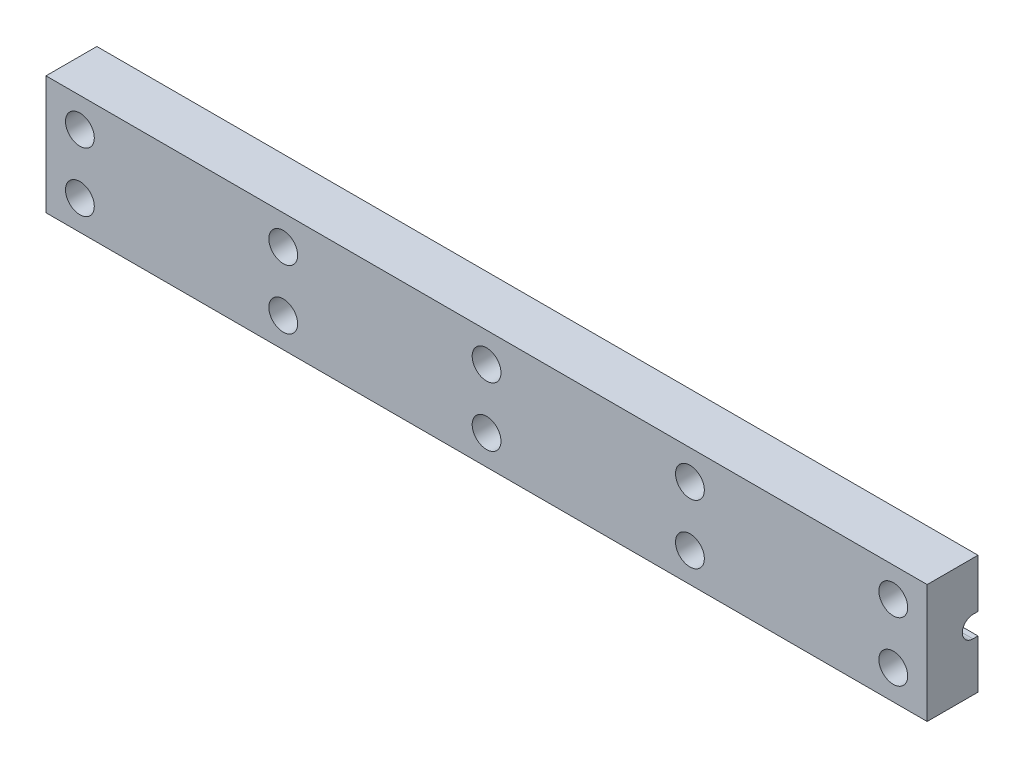
ISO-10303-21;
HEADER;
FILE_DESCRIPTION(('STEP AP214'),'2;1');
FILE_NAME('part.step','',(''),(''),'','','');
FILE_SCHEMA(('AUTOMOTIVE_DESIGN { 1 0 10303 214 1 1 1 1 }'));
ENDSEC;
DATA;
#1=APPLICATION_CONTEXT('core data for automotive mechanical design processes');
#2=APPLICATION_PROTOCOL_DEFINITION('international standard','automotive_design',2000,#1);
#3=PRODUCT_CONTEXT('',#1,'mechanical');
#4=PRODUCT('Part','Part','',(#3));
#5=PRODUCT_RELATED_PRODUCT_CATEGORY('part','',(#4));
#6=PRODUCT_DEFINITION_FORMATION('','',#4);
#7=PRODUCT_DEFINITION_CONTEXT('part definition',#1,'design');
#8=PRODUCT_DEFINITION('design','',#6,#7);
#9=PRODUCT_DEFINITION_SHAPE('','',#8);
#10=(LENGTH_UNIT() NAMED_UNIT(*) SI_UNIT(.MILLI.,.METRE.));
#11=(NAMED_UNIT(*) PLANE_ANGLE_UNIT() SI_UNIT($,.RADIAN.));
#12=(NAMED_UNIT(*) SI_UNIT($,.STERADIAN.) SOLID_ANGLE_UNIT());
#13=UNCERTAINTY_MEASURE_WITH_UNIT(LENGTH_MEASURE(1.E-05),#10,'distance_accuracy_value','');
#14=(GEOMETRIC_REPRESENTATION_CONTEXT(3) GLOBAL_UNCERTAINTY_ASSIGNED_CONTEXT((#13)) GLOBAL_UNIT_ASSIGNED_CONTEXT((#10,
#11,#12)) REPRESENTATION_CONTEXT('',''));
#15=CARTESIAN_POINT('',(0.,0.,0.));
#16=DIRECTION('',(0.,0.,1.));
#17=DIRECTION('',(1.,0.,0.));
#18=AXIS2_PLACEMENT_3D('',#15,#16,#17);
#19=CARTESIAN_POINT('',(170.645147999783,197.163538158501,246.970904960978));
#20=DIRECTION('',(0.,0.,1.));
#21=DIRECTION('',(1.,0.,0.));
#22=AXIS2_PLACEMENT_3D('',#19,#20,#21);
#23=PLANE('',#22);
#24=CARTESIAN_POINT('',(150.645147999783,197.6635381585,246.970904960979));
#25=DIRECTION('',(0.,0.,1.));
#26=DIRECTION('',(1.,0.,0.));
#27=AXIS2_PLACEMENT_3D('',#24,#25,#26);
#28=CIRCLE('',#27,1.70000000000001);
#29=CARTESIAN_POINT('',(152.345147999783,197.6635381585,246.970904960979));
#30=VERTEX_POINT('',#29);
#31=EDGE_CURVE('E223',#30,#30,#28,.T.);
#32=ORIENTED_EDGE('',*,*,#31,.F.);
#33=EDGE_LOOP('',(#32));
#34=FACE_BOUND('',#33,.T.);
#35=CARTESIAN_POINT('',(150.645147999783,204.663538158501,246.970904960979));
#36=DIRECTION('',(0.,0.,1.));
#37=DIRECTION('',(1.,0.,0.));
#38=AXIS2_PLACEMENT_3D('',#35,#36,#37);
#39=CIRCLE('',#38,1.70000000000001);
#40=CARTESIAN_POINT('',(152.345147999783,204.663538158501,246.970904960979));
#41=VERTEX_POINT('',#40);
#42=EDGE_CURVE('E131',#41,#41,#39,.T.);
#43=ORIENTED_EDGE('',*,*,#42,.F.);
#44=EDGE_LOOP('',(#43));
#45=FACE_BOUND('',#44,.T.);
#46=CARTESIAN_POINT('',(198.645147999783,204.663538158501,246.970904960979));
#47=DIRECTION('',(0.,0.,1.));
#48=DIRECTION('',(1.,0.,0.));
#49=AXIS2_PLACEMENT_3D('',#46,#47,#48);
#50=CIRCLE('',#49,1.70000000000001);
#51=CARTESIAN_POINT('',(200.345147999783,204.663538158501,246.970904960979));
#52=VERTEX_POINT('',#51);
#53=EDGE_CURVE('E160',#52,#52,#50,.F.);
#54=ORIENTED_EDGE('',*,*,#53,.T.);
#55=EDGE_LOOP('',(#54));
#56=FACE_BOUND('',#55,.T.);
#57=CARTESIAN_POINT('',(246.645147999783,204.663538158501,246.970904960979));
#58=DIRECTION('',(0.,0.,1.));
#59=DIRECTION('',(1.,0.,0.));
#60=AXIS2_PLACEMENT_3D('',#57,#58,#59);
#61=CIRCLE('',#60,1.70000000000001);
#62=CARTESIAN_POINT('',(248.345147999783,204.663538158501,246.970904960979));
#63=VERTEX_POINT('',#62);
#64=EDGE_CURVE('E150',#63,#63,#61,.F.);
#65=ORIENTED_EDGE('',*,*,#64,.T.);
#66=EDGE_LOOP('',(#65));
#67=FACE_BOUND('',#66,.T.);
#68=CARTESIAN_POINT('',(222.645147999783,197.663538158501,246.970904960979));
#69=DIRECTION('',(0.,0.,1.));
#70=DIRECTION('',(1.,0.,0.));
#71=AXIS2_PLACEMENT_3D('',#68,#69,#70);
#72=CIRCLE('',#71,1.70000000000001);
#73=CARTESIAN_POINT('',(224.345147999783,197.663538158501,246.970904960979));
#74=VERTEX_POINT('',#73);
#75=EDGE_CURVE('E151',#74,#74,#72,.T.);
#76=ORIENTED_EDGE('',*,*,#75,.F.);
#77=EDGE_LOOP('',(#76));
#78=FACE_BOUND('',#77,.T.);
#79=CARTESIAN_POINT('',(174.645147999783,197.6635381585,246.970904960979));
#80=DIRECTION('',(0.,0.,1.));
#81=DIRECTION('',(1.,0.,0.));
#82=AXIS2_PLACEMENT_3D('',#79,#80,#81);
#83=CIRCLE('',#82,1.70000000000001);
#84=CARTESIAN_POINT('',(176.345147999783,197.6635381585,246.970904960979));
#85=VERTEX_POINT('',#84);
#86=EDGE_CURVE('E166',#85,#85,#83,.T.);
#87=ORIENTED_EDGE('',*,*,#86,.F.);
#88=EDGE_LOOP('',(#87));
#89=FACE_BOUND('',#88,.T.);
#90=DIRECTION('',(1.,0.,0.));
#91=VECTOR('',#90,1.);
#92=CARTESIAN_POINT('',(170.645147999783,194.163538158501,246.970904960978));
#93=LINE('',#92,#91);
#94=CARTESIAN_POINT('',(146.645147999783,194.163538158501,246.970904960978));
#95=VERTEX_POINT('',#94);
#96=CARTESIAN_POINT('',(250.645147999783,194.163538158501,246.970904960978));
#97=VERTEX_POINT('',#96);
#98=EDGE_CURVE('E113',#95,#97,#93,.T.);
#99=ORIENTED_EDGE('',*,*,#98,.T.);
#100=DIRECTION('',(0.,-1.,0.));
#101=VECTOR('',#100,1.);
#102=CARTESIAN_POINT('',(250.645147999783,208.163538158501,246.970904960978));
#103=LINE('',#102,#101);
#104=CARTESIAN_POINT('',(250.645147999783,208.163538158501,246.970904960978));
#105=VERTEX_POINT('',#104);
#106=EDGE_CURVE('E109',#105,#97,#103,.T.);
#107=ORIENTED_EDGE('',*,*,#106,.F.);
#108=DIRECTION('',(1.,0.,0.));
#109=VECTOR('',#108,1.);
#110=CARTESIAN_POINT('',(170.645147999783,208.163538158501,246.970904960978));
#111=LINE('',#110,#109);
#112=CARTESIAN_POINT('',(146.645147999783,208.163538158501,246.970904960978));
#113=VERTEX_POINT('',#112);
#114=EDGE_CURVE('E103',#113,#105,#111,.T.);
#115=ORIENTED_EDGE('',*,*,#114,.F.);
#116=DIRECTION('',(0.,1.,0.));
#117=VECTOR('',#116,1.);
#118=CARTESIAN_POINT('',(146.645147999783,194.163538158501,246.970904960978));
#119=LINE('',#118,#117);
#120=EDGE_CURVE('E107',#95,#113,#119,.T.);
#121=ORIENTED_EDGE('',*,*,#120,.F.);
#122=EDGE_LOOP('',(#99,#107,#115,#121));
#123=FACE_BOUND('',#122,.T.);
#124=CARTESIAN_POINT('',(246.645147999783,197.663538158501,246.970904960979));
#125=DIRECTION('',(0.,0.,1.));
#126=DIRECTION('',(1.,0.,0.));
#127=AXIS2_PLACEMENT_3D('',#124,#125,#126);
#128=CIRCLE('',#127,1.70000000000001);
#129=CARTESIAN_POINT('',(248.345147999783,197.663538158501,246.970904960979));
#130=VERTEX_POINT('',#129);
#131=EDGE_CURVE('E147',#130,#130,#128,.T.);
#132=ORIENTED_EDGE('',*,*,#131,.F.);
#133=EDGE_LOOP('',(#132));
#134=FACE_BOUND('',#133,.T.);
#135=CARTESIAN_POINT('',(174.645147999783,204.663538158501,246.970904960979));
#136=DIRECTION('',(0.,0.,1.));
#137=DIRECTION('',(1.,0.,0.));
#138=AXIS2_PLACEMENT_3D('',#135,#136,#137);
#139=CIRCLE('',#138,1.70000000000001);
#140=CARTESIAN_POINT('',(176.345147999783,204.663538158501,246.970904960979));
#141=VERTEX_POINT('',#140);
#142=EDGE_CURVE('E163',#141,#141,#139,.F.);
#143=ORIENTED_EDGE('',*,*,#142,.T.);
#144=EDGE_LOOP('',(#143));
#145=FACE_BOUND('',#144,.T.);
#146=CARTESIAN_POINT('',(198.645147999783,197.663538158501,246.970904960979));
#147=DIRECTION('',(0.,0.,1.));
#148=DIRECTION('',(1.,0.,0.));
#149=AXIS2_PLACEMENT_3D('',#146,#147,#148);
#150=CIRCLE('',#149,1.70000000000001);
#151=CARTESIAN_POINT('',(200.345147999783,197.663538158501,246.970904960979));
#152=VERTEX_POINT('',#151);
#153=EDGE_CURVE('E157',#152,#152,#150,.T.);
#154=ORIENTED_EDGE('',*,*,#153,.F.);
#155=EDGE_LOOP('',(#154));
#156=FACE_BOUND('',#155,.T.);
#157=CARTESIAN_POINT('',(222.645147999783,204.663538158501,246.970904960979));
#158=DIRECTION('',(0.,0.,1.));
#159=DIRECTION('',(1.,0.,0.));
#160=AXIS2_PLACEMENT_3D('',#157,#158,#159);
#161=CIRCLE('',#160,1.70000000000001);
#162=CARTESIAN_POINT('',(224.345147999783,204.663538158501,246.970904960979));
#163=VERTEX_POINT('',#162);
#164=EDGE_CURVE('E154',#163,#163,#161,.F.);
#165=ORIENTED_EDGE('',*,*,#164,.T.);
#166=EDGE_LOOP('',(#165));
#167=FACE_BOUND('',#166,.T.);
#168=ADVANCED_FACE('F37',(#34,#45,#56,#67,#78,#89,#123,#134,#145,#156,#167),#23,.T.);
#169=CARTESIAN_POINT('',(170.645147999783,208.163538158501,240.970904960978));
#170=DIRECTION('',(0.,1.,0.));
#171=DIRECTION('',(0.,0.,1.));
#172=AXIS2_PLACEMENT_3D('',#169,#170,#171);
#173=PLANE('',#172);
#174=ORIENTED_EDGE('',*,*,#114,.T.);
#175=DIRECTION('',(0.,0.,1.));
#176=VECTOR('',#175,1.);
#177=CARTESIAN_POINT('',(250.645147999783,208.163538158501,240.970904960978));
#178=LINE('',#177,#176);
#179=CARTESIAN_POINT('',(250.645147999783,208.163538158501,240.970904960978));
#180=VERTEX_POINT('',#179);
#181=EDGE_CURVE('E195',#180,#105,#178,.T.);
#182=ORIENTED_EDGE('',*,*,#181,.F.);
#183=DIRECTION('',(1.,0.,0.));
#184=VECTOR('',#183,1.);
#185=CARTESIAN_POINT('',(170.645147999783,208.163538158501,240.970904960978));
#186=LINE('',#185,#184);
#187=CARTESIAN_POINT('',(146.645147999783,208.163538158501,240.970904960978));
#188=VERTEX_POINT('',#187);
#189=EDGE_CURVE('E11',#188,#180,#186,.T.);
#190=ORIENTED_EDGE('',*,*,#189,.F.);
#191=DIRECTION('',(0.,0.,-1.));
#192=VECTOR('',#191,1.);
#193=CARTESIAN_POINT('',(146.645147999783,208.163538158501,246.970904960978));
#194=LINE('',#193,#192);
#195=EDGE_CURVE('E117',#113,#188,#194,.T.);
#196=ORIENTED_EDGE('',*,*,#195,.F.);
#197=EDGE_LOOP('',(#174,#182,#190,#196));
#198=FACE_BOUND('',#197,.T.);
#199=ADVANCED_FACE('F39',(#198),#173,.T.);
#200=CARTESIAN_POINT('',(170.645147999783,205.163538158501,240.970904960978));
#201=DIRECTION('',(0.,0.,-1.));
#202=DIRECTION('',(-1.,0.,0.));
#203=AXIS2_PLACEMENT_3D('',#200,#201,#202);
#204=PLANE('',#203);
#205=CARTESIAN_POINT('',(150.645147999783,204.663538158501,240.970904960978));
#206=DIRECTION('',(0.,0.,-1.));
#207=DIRECTION('',(-1.,0.,0.));
#208=AXIS2_PLACEMENT_3D('',#205,#206,#207);
#209=CIRCLE('',#208,1.70000000000001);
#210=CARTESIAN_POINT('',(148.945147999783,204.663538158501,240.970904960978));
#211=VERTEX_POINT('',#210);
#212=EDGE_CURVE('E41',#211,#211,#209,.T.);
#213=ORIENTED_EDGE('',*,*,#212,.F.);
#214=EDGE_LOOP('',(#213));
#215=FACE_BOUND('',#214,.T.);
#216=CARTESIAN_POINT('',(222.645147999783,204.663538158501,240.970904960978));
#217=DIRECTION('',(0.,0.,-1.));
#218=DIRECTION('',(-1.,0.,0.));
#219=AXIS2_PLACEMENT_3D('',#216,#217,#218);
#220=CIRCLE('',#219,1.70000000000001);
#221=CARTESIAN_POINT('',(220.945147999783,204.663538158501,240.970904960978));
#222=VERTEX_POINT('',#221);
#223=EDGE_CURVE('E192',#222,#222,#220,.F.);
#224=ORIENTED_EDGE('',*,*,#223,.T.);
#225=EDGE_LOOP('',(#224));
#226=FACE_BOUND('',#225,.T.);
#227=CARTESIAN_POINT('',(198.645147999783,204.663538158501,240.970904960978));
#228=DIRECTION('',(0.,0.,-1.));
#229=DIRECTION('',(-1.,0.,0.));
#230=AXIS2_PLACEMENT_3D('',#227,#228,#229);
#231=CIRCLE('',#230,1.70000000000001);
#232=CARTESIAN_POINT('',(196.945147999783,204.663538158501,240.970904960978));
#233=VERTEX_POINT('',#232);
#234=EDGE_CURVE('E186',#233,#233,#231,.F.);
#235=ORIENTED_EDGE('',*,*,#234,.T.);
#236=EDGE_LOOP('',(#235));
#237=FACE_BOUND('',#236,.T.);
#238=CARTESIAN_POINT('',(174.645147999783,204.663538158501,240.970904960978));
#239=DIRECTION('',(0.,0.,-1.));
#240=DIRECTION('',(-1.,0.,0.));
#241=AXIS2_PLACEMENT_3D('',#238,#239,#240);
#242=CIRCLE('',#241,1.70000000000001);
#243=CARTESIAN_POINT('',(172.945147999783,204.663538158501,240.970904960978));
#244=VERTEX_POINT('',#243);
#245=EDGE_CURVE('E183',#244,#244,#242,.F.);
#246=ORIENTED_EDGE('',*,*,#245,.T.);
#247=EDGE_LOOP('',(#246));
#248=FACE_BOUND('',#247,.T.);
#249=CARTESIAN_POINT('',(246.645147999783,204.663538158501,240.970904960978));
#250=DIRECTION('',(0.,0.,-1.));
#251=DIRECTION('',(-1.,0.,0.));
#252=AXIS2_PLACEMENT_3D('',#249,#250,#251);
#253=CIRCLE('',#252,1.70000000000001);
#254=CARTESIAN_POINT('',(244.945147999783,204.663538158501,240.970904960978));
#255=VERTEX_POINT('',#254);
#256=EDGE_CURVE('E177',#255,#255,#253,.F.);
#257=ORIENTED_EDGE('',*,*,#256,.T.);
#258=EDGE_LOOP('',(#257));
#259=FACE_BOUND('',#258,.T.);
#260=ORIENTED_EDGE('',*,*,#189,.T.);
#261=DIRECTION('',(0.,1.,0.));
#262=VECTOR('',#261,1.);
#263=CARTESIAN_POINT('',(250.645147999783,202.413538158492,240.970904960978));
#264=LINE('',#263,#262);
#265=CARTESIAN_POINT('',(250.645147999783,202.413538158492,240.970904960978));
#266=VERTEX_POINT('',#265);
#267=EDGE_CURVE('E114',#266,#180,#264,.T.);
#268=ORIENTED_EDGE('',*,*,#267,.F.);
#269=DIRECTION('',(1.,0.,0.));
#270=VECTOR('',#269,1.);
#271=CARTESIAN_POINT('',(170.645147999783,202.413538158492,240.970904960978));
#272=LINE('',#271,#270);
#273=CARTESIAN_POINT('',(146.645147999783,202.413538158492,240.970904960978));
#274=VERTEX_POINT('',#273);
#275=EDGE_CURVE('E46',#274,#266,#272,.T.);
#276=ORIENTED_EDGE('',*,*,#275,.F.);
#277=DIRECTION('',(0.,-1.,0.));
#278=VECTOR('',#277,1.);
#279=CARTESIAN_POINT('',(146.645147999783,208.163538158501,240.970904960978));
#280=LINE('',#279,#278);
#281=EDGE_CURVE('E120',#188,#274,#280,.T.);
#282=ORIENTED_EDGE('',*,*,#281,.F.);
#283=EDGE_LOOP('',(#260,#268,#276,#282));
#284=FACE_BOUND('',#283,.T.);
#285=ADVANCED_FACE('F265',(#215,#226,#237,#248,#259,#284),#204,.T.);
#286=CARTESIAN_POINT('',(170.645147999783,202.413538158492,241.570904954906));
#287=DIRECTION('',(0.,-1.,0.));
#288=DIRECTION('',(0.,0.,-1.));
#289=AXIS2_PLACEMENT_3D('',#286,#287,#288);
#290=PLANE('',#289);
#291=ORIENTED_EDGE('',*,*,#275,.T.);
#292=DIRECTION('',(0.,0.,-1.));
#293=VECTOR('',#292,1.);
#294=CARTESIAN_POINT('',(250.645147999783,202.413538158492,241.570904954906));
#295=LINE('',#294,#293);
#296=CARTESIAN_POINT('',(250.645147999783,202.413538158492,241.570904954906));
#297=VERTEX_POINT('',#296);
#298=EDGE_CURVE('E210',#297,#266,#295,.T.);
#299=ORIENTED_EDGE('',*,*,#298,.F.);
#300=DIRECTION('',(1.,0.,0.));
#301=VECTOR('',#300,1.);
#302=CARTESIAN_POINT('',(170.645147999783,202.413538158492,241.570904954906));
#303=LINE('',#302,#301);
#304=CARTESIAN_POINT('',(146.645147999783,202.413538158492,241.570904954906));
#305=VERTEX_POINT('',#304);
#306=EDGE_CURVE('E214',#305,#297,#303,.T.);
#307=ORIENTED_EDGE('',*,*,#306,.F.);
#308=DIRECTION('',(0.,0.,1.));
#309=VECTOR('',#308,1.);
#310=CARTESIAN_POINT('',(146.645147999783,202.413538158492,240.970904960978));
#311=LINE('',#310,#309);
#312=EDGE_CURVE('E135',#274,#305,#311,.T.);
#313=ORIENTED_EDGE('',*,*,#312,.F.);
#314=EDGE_LOOP('',(#291,#299,#307,#313));
#315=FACE_BOUND('',#314,.T.);
#316=ADVANCED_FACE('F268',(#315),#290,.T.);
#317=CARTESIAN_POINT('',(170.645147999783,201.163538158492,241.570904960977));
#318=DIRECTION('',(1.,0.,0.));
#319=DIRECTION('',(0.,0.,-1.));
#320=AXIS2_PLACEMENT_3D('',#317,#318,#319);
#321=CYLINDRICAL_SURFACE('',#320,1.25);
#322=ORIENTED_EDGE('',*,*,#306,.T.);
#323=CARTESIAN_POINT('',(250.645147999783,201.163538158492,241.570904960977));
#324=DIRECTION('',(-1.,0.,0.));
#325=DIRECTION('',(0.,0.,-1.));
#326=AXIS2_PLACEMENT_3D('',#323,#324,#325);
#327=CIRCLE('',#326,1.25);
#328=CARTESIAN_POINT('',(250.645147999783,199.913538158492,241.570904960977));
#329=VERTEX_POINT('',#328);
#330=EDGE_CURVE('E207',#329,#297,#327,.T.);
#331=ORIENTED_EDGE('',*,*,#330,.F.);
#332=DIRECTION('',(1.,0.,0.));
#333=VECTOR('',#332,1.);
#334=CARTESIAN_POINT('',(170.645147999783,199.913538158492,241.570904960977));
#335=LINE('',#334,#333);
#336=CARTESIAN_POINT('',(146.645147999783,199.913538158492,241.570904960977));
#337=VERTEX_POINT('',#336);
#338=EDGE_CURVE('E216',#337,#329,#335,.T.);
#339=ORIENTED_EDGE('',*,*,#338,.F.);
#340=CARTESIAN_POINT('',(146.645147999783,201.163538158492,241.570904960977));
#341=DIRECTION('',(1.,0.,0.));
#342=DIRECTION('',(0.,0.,1.));
#343=AXIS2_PLACEMENT_3D('',#340,#341,#342);
#344=CIRCLE('',#343,1.25);
#345=EDGE_CURVE('E138',#305,#337,#344,.T.);
#346=ORIENTED_EDGE('',*,*,#345,.F.);
#347=EDGE_LOOP('',(#322,#331,#339,#346));
#348=FACE_BOUND('',#347,.T.);
#349=ADVANCED_FACE('F272',(#348),#321,.F.);
#350=CARTESIAN_POINT('',(170.645147999783,199.913538158492,240.970904960978));
#351=DIRECTION('',(0.,1.,0.));
#352=DIRECTION('',(0.,0.,1.));
#353=AXIS2_PLACEMENT_3D('',#350,#351,#352);
#354=PLANE('',#353);
#355=ORIENTED_EDGE('',*,*,#338,.T.);
#356=DIRECTION('',(0.,0.,1.));
#357=VECTOR('',#356,1.);
#358=CARTESIAN_POINT('',(250.645147999783,199.913538158492,240.970904960978));
#359=LINE('',#358,#357);
#360=CARTESIAN_POINT('',(250.645147999783,199.913538158492,240.970904960978));
#361=VERTEX_POINT('',#360);
#362=EDGE_CURVE('E204',#361,#329,#359,.T.);
#363=ORIENTED_EDGE('',*,*,#362,.F.);
#364=DIRECTION('',(1.,0.,0.));
#365=VECTOR('',#364,1.);
#366=CARTESIAN_POINT('',(170.645147999783,199.913538158492,240.970904960978));
#367=LINE('',#366,#365);
#368=CARTESIAN_POINT('',(146.645147999783,199.913538158492,240.970904960978));
#369=VERTEX_POINT('',#368);
#370=EDGE_CURVE('E218',#369,#361,#367,.T.);
#371=ORIENTED_EDGE('',*,*,#370,.F.);
#372=DIRECTION('',(0.,0.,-1.));
#373=VECTOR('',#372,1.);
#374=CARTESIAN_POINT('',(146.645147999783,199.913538158492,241.570904960977));
#375=LINE('',#374,#373);
#376=EDGE_CURVE('E141',#337,#369,#375,.T.);
#377=ORIENTED_EDGE('',*,*,#376,.F.);
#378=EDGE_LOOP('',(#355,#363,#371,#377));
#379=FACE_BOUND('',#378,.T.);
#380=ADVANCED_FACE('F275',(#379),#354,.T.);
#381=CARTESIAN_POINT('',(170.645147999783,197.163538158501,240.970904960978));
#382=DIRECTION('',(0.,0.,-1.));
#383=DIRECTION('',(-1.,0.,0.));
#384=AXIS2_PLACEMENT_3D('',#381,#382,#383);
#385=PLANE('',#384);
#386=CARTESIAN_POINT('',(150.645147999783,197.6635381585,240.970904960978));
#387=DIRECTION('',(0.,0.,-1.));
#388=DIRECTION('',(-1.,0.,0.));
#389=AXIS2_PLACEMENT_3D('',#386,#387,#388);
#390=CIRCLE('',#389,1.70000000000001);
#391=CARTESIAN_POINT('',(148.945147999783,197.6635381585,240.970904960978));
#392=VERTEX_POINT('',#391);
#393=EDGE_CURVE('E129',#392,#392,#390,.T.);
#394=ORIENTED_EDGE('',*,*,#393,.F.);
#395=EDGE_LOOP('',(#394));
#396=FACE_BOUND('',#395,.T.);
#397=CARTESIAN_POINT('',(198.645147999783,197.663538158501,240.970904960978));
#398=DIRECTION('',(0.,0.,-1.));
#399=DIRECTION('',(-1.,0.,0.));
#400=AXIS2_PLACEMENT_3D('',#397,#398,#399);
#401=CIRCLE('',#400,1.70000000000001);
#402=CARTESIAN_POINT('',(196.945147999783,197.663538158501,240.970904960978));
#403=VERTEX_POINT('',#402);
#404=EDGE_CURVE('E189',#403,#403,#401,.T.);
#405=ORIENTED_EDGE('',*,*,#404,.F.);
#406=EDGE_LOOP('',(#405));
#407=FACE_BOUND('',#406,.T.);
#408=CARTESIAN_POINT('',(246.645147999783,197.663538158501,240.970904960978));
#409=DIRECTION('',(0.,0.,-1.));
#410=DIRECTION('',(-1.,0.,0.));
#411=AXIS2_PLACEMENT_3D('',#408,#409,#410);
#412=CIRCLE('',#411,1.70000000000001);
#413=CARTESIAN_POINT('',(244.945147999783,197.663538158501,240.970904960978));
#414=VERTEX_POINT('',#413);
#415=EDGE_CURVE('E180',#414,#414,#412,.T.);
#416=ORIENTED_EDGE('',*,*,#415,.F.);
#417=EDGE_LOOP('',(#416));
#418=FACE_BOUND('',#417,.T.);
#419=CARTESIAN_POINT('',(222.645147999783,197.663538158501,240.970904960978));
#420=DIRECTION('',(0.,0.,-1.));
#421=DIRECTION('',(-1.,0.,0.));
#422=AXIS2_PLACEMENT_3D('',#419,#420,#421);
#423=CIRCLE('',#422,1.70000000000001);
#424=CARTESIAN_POINT('',(220.945147999783,197.663538158501,240.970904960978));
#425=VERTEX_POINT('',#424);
#426=EDGE_CURVE('E174',#425,#425,#423,.T.);
#427=ORIENTED_EDGE('',*,*,#426,.F.);
#428=EDGE_LOOP('',(#427));
#429=FACE_BOUND('',#428,.T.);
#430=CARTESIAN_POINT('',(174.645147999783,197.6635381585,240.970904960978));
#431=DIRECTION('',(0.,0.,-1.));
#432=DIRECTION('',(-1.,0.,0.));
#433=AXIS2_PLACEMENT_3D('',#430,#431,#432);
#434=CIRCLE('',#433,1.70000000000001);
#435=CARTESIAN_POINT('',(172.945147999783,197.6635381585,240.970904960978));
#436=VERTEX_POINT('',#435);
#437=EDGE_CURVE('E171',#436,#436,#434,.T.);
#438=ORIENTED_EDGE('',*,*,#437,.F.);
#439=EDGE_LOOP('',(#438));
#440=FACE_BOUND('',#439,.T.);
#441=ORIENTED_EDGE('',*,*,#370,.T.);
#442=DIRECTION('',(0.,1.,0.));
#443=VECTOR('',#442,1.);
#444=CARTESIAN_POINT('',(250.645147999783,194.163538158501,240.970904960978));
#445=LINE('',#444,#443);
#446=CARTESIAN_POINT('',(250.645147999783,194.163538158501,240.970904960978));
#447=VERTEX_POINT('',#446);
#448=EDGE_CURVE('E201',#447,#361,#445,.T.);
#449=ORIENTED_EDGE('',*,*,#448,.F.);
#450=DIRECTION('',(1.,0.,0.));
#451=VECTOR('',#450,1.);
#452=CARTESIAN_POINT('',(170.645147999783,194.163538158501,240.970904960978));
#453=LINE('',#452,#451);
#454=CARTESIAN_POINT('',(146.645147999783,194.163538158501,240.970904960978));
#455=VERTEX_POINT('',#454);
#456=EDGE_CURVE('E220',#455,#447,#453,.T.);
#457=ORIENTED_EDGE('',*,*,#456,.F.);
#458=DIRECTION('',(0.,-1.,0.));
#459=VECTOR('',#458,1.);
#460=CARTESIAN_POINT('',(146.645147999783,199.913538158492,240.970904960978));
#461=LINE('',#460,#459);
#462=EDGE_CURVE('E144',#369,#455,#461,.T.);
#463=ORIENTED_EDGE('',*,*,#462,.F.);
#464=EDGE_LOOP('',(#441,#449,#457,#463));
#465=FACE_BOUND('',#464,.T.);
#466=ADVANCED_FACE('F279',(#396,#407,#418,#429,#440,#465),#385,.T.);
#467=CARTESIAN_POINT('',(170.645147999783,194.163538158501,246.970904960978));
#468=DIRECTION('',(0.,-1.,0.));
#469=DIRECTION('',(0.,0.,-1.));
#470=AXIS2_PLACEMENT_3D('',#467,#468,#469);
#471=PLANE('',#470);
#472=ORIENTED_EDGE('',*,*,#456,.T.);
#473=DIRECTION('',(0.,0.,-1.));
#474=VECTOR('',#473,1.);
#475=CARTESIAN_POINT('',(250.645147999783,194.163538158501,246.970904960978));
#476=LINE('',#475,#474);
#477=EDGE_CURVE('E198',#97,#447,#476,.T.);
#478=ORIENTED_EDGE('',*,*,#477,.F.);
#479=ORIENTED_EDGE('',*,*,#98,.F.);
#480=DIRECTION('',(0.,0.,1.));
#481=VECTOR('',#480,1.);
#482=CARTESIAN_POINT('',(146.645147999783,194.163538158501,240.970904960978));
#483=LINE('',#482,#481);
#484=EDGE_CURVE('E126',#455,#95,#483,.T.);
#485=ORIENTED_EDGE('',*,*,#484,.F.);
#486=EDGE_LOOP('',(#472,#478,#479,#485));
#487=FACE_BOUND('',#486,.T.);
#488=ADVANCED_FACE('F258',(#487),#471,.T.);
#489=CARTESIAN_POINT('',(250.645147999783,201.163538158492,241.570904960977));
#490=DIRECTION('',(1.,0.,0.));
#491=DIRECTION('',(0.,0.,-1.));
#492=AXIS2_PLACEMENT_3D('',#489,#490,#491);
#493=PLANE('',#492);
#494=ORIENTED_EDGE('',*,*,#181,.T.);
#495=ORIENTED_EDGE('',*,*,#106,.T.);
#496=ORIENTED_EDGE('',*,*,#477,.T.);
#497=ORIENTED_EDGE('',*,*,#448,.T.);
#498=ORIENTED_EDGE('',*,*,#362,.T.);
#499=ORIENTED_EDGE('',*,*,#330,.T.);
#500=ORIENTED_EDGE('',*,*,#298,.T.);
#501=ORIENTED_EDGE('',*,*,#267,.T.);
#502=EDGE_LOOP('',(#494,#495,#496,#497,#498,#499,#500,#501));
#503=FACE_BOUND('',#502,.T.);
#504=ADVANCED_FACE('F248',(#503),#493,.T.);
#505=CARTESIAN_POINT('',(174.645147999783,197.6635381585,236.970904960979));
#506=DIRECTION('',(0.,0.,1.));
#507=DIRECTION('',(1.,0.,0.));
#508=AXIS2_PLACEMENT_3D('',#505,#506,#507);
#509=CYLINDRICAL_SURFACE('',#508,1.70000000000001);
#510=ORIENTED_EDGE('',*,*,#437,.T.);
#511=EDGE_LOOP('',(#510));
#512=FACE_BOUND('',#511,.T.);
#513=ORIENTED_EDGE('',*,*,#86,.T.);
#514=EDGE_LOOP('',(#513));
#515=FACE_BOUND('',#514,.T.);
#516=ADVANCED_FACE('F245',(#512,#515),#509,.F.);
#517=CARTESIAN_POINT('',(222.645147999783,197.663538158501,236.970904960979));
#518=DIRECTION('',(0.,0.,1.));
#519=DIRECTION('',(1.,0.,0.));
#520=AXIS2_PLACEMENT_3D('',#517,#518,#519);
#521=CYLINDRICAL_SURFACE('',#520,1.70000000000001);
#522=ORIENTED_EDGE('',*,*,#426,.T.);
#523=EDGE_LOOP('',(#522));
#524=FACE_BOUND('',#523,.T.);
#525=ORIENTED_EDGE('',*,*,#75,.T.);
#526=EDGE_LOOP('',(#525));
#527=FACE_BOUND('',#526,.T.);
#528=ADVANCED_FACE('F247',(#524,#527),#521,.F.);
#529=CARTESIAN_POINT('',(246.645147999783,204.663538158501,236.970904960979));
#530=DIRECTION('',(0.,0.,1.));
#531=DIRECTION('',(1.,0.,0.));
#532=AXIS2_PLACEMENT_3D('',#529,#530,#531);
#533=CYLINDRICAL_SURFACE('',#532,1.70000000000001);
#534=ORIENTED_EDGE('',*,*,#256,.F.);
#535=EDGE_LOOP('',(#534));
#536=FACE_BOUND('',#535,.T.);
#537=ORIENTED_EDGE('',*,*,#64,.F.);
#538=EDGE_LOOP('',(#537));
#539=FACE_BOUND('',#538,.T.);
#540=ADVANCED_FACE('F255',(#536,#539),#533,.F.);
#541=CARTESIAN_POINT('',(246.645147999783,197.663538158501,236.970904960979));
#542=DIRECTION('',(0.,0.,1.));
#543=DIRECTION('',(1.,0.,0.));
#544=AXIS2_PLACEMENT_3D('',#541,#542,#543);
#545=CYLINDRICAL_SURFACE('',#544,1.70000000000001);
#546=ORIENTED_EDGE('',*,*,#415,.T.);
#547=EDGE_LOOP('',(#546));
#548=FACE_BOUND('',#547,.T.);
#549=ORIENTED_EDGE('',*,*,#131,.T.);
#550=EDGE_LOOP('',(#549));
#551=FACE_BOUND('',#550,.T.);
#552=ADVANCED_FACE('F424',(#548,#551),#545,.F.);
#553=CARTESIAN_POINT('',(174.645147999783,204.663538158501,236.970904960979));
#554=DIRECTION('',(0.,0.,1.));
#555=DIRECTION('',(1.,0.,0.));
#556=AXIS2_PLACEMENT_3D('',#553,#554,#555);
#557=CYLINDRICAL_SURFACE('',#556,1.70000000000001);
#558=ORIENTED_EDGE('',*,*,#245,.F.);
#559=EDGE_LOOP('',(#558));
#560=FACE_BOUND('',#559,.T.);
#561=ORIENTED_EDGE('',*,*,#142,.F.);
#562=EDGE_LOOP('',(#561));
#563=FACE_BOUND('',#562,.T.);
#564=ADVANCED_FACE('F416',(#560,#563),#557,.F.);
#565=CARTESIAN_POINT('',(198.645147999783,204.663538158501,236.970904960979));
#566=DIRECTION('',(0.,0.,1.));
#567=DIRECTION('',(1.,0.,0.));
#568=AXIS2_PLACEMENT_3D('',#565,#566,#567);
#569=CYLINDRICAL_SURFACE('',#568,1.70000000000001);
#570=ORIENTED_EDGE('',*,*,#234,.F.);
#571=EDGE_LOOP('',(#570));
#572=FACE_BOUND('',#571,.T.);
#573=ORIENTED_EDGE('',*,*,#53,.F.);
#574=EDGE_LOOP('',(#573));
#575=FACE_BOUND('',#574,.T.);
#576=ADVANCED_FACE('F262',(#572,#575),#569,.F.);
#577=CARTESIAN_POINT('',(198.645147999783,197.663538158501,236.970904960979));
#578=DIRECTION('',(0.,0.,1.));
#579=DIRECTION('',(1.,0.,0.));
#580=AXIS2_PLACEMENT_3D('',#577,#578,#579);
#581=CYLINDRICAL_SURFACE('',#580,1.70000000000001);
#582=ORIENTED_EDGE('',*,*,#404,.T.);
#583=EDGE_LOOP('',(#582));
#584=FACE_BOUND('',#583,.T.);
#585=ORIENTED_EDGE('',*,*,#153,.T.);
#586=EDGE_LOOP('',(#585));
#587=FACE_BOUND('',#586,.T.);
#588=ADVANCED_FACE('F399',(#584,#587),#581,.F.);
#589=CARTESIAN_POINT('',(222.645147999783,204.663538158501,236.970904960979));
#590=DIRECTION('',(0.,0.,1.));
#591=DIRECTION('',(1.,0.,0.));
#592=AXIS2_PLACEMENT_3D('',#589,#590,#591);
#593=CYLINDRICAL_SURFACE('',#592,1.70000000000001);
#594=ORIENTED_EDGE('',*,*,#223,.F.);
#595=EDGE_LOOP('',(#594));
#596=FACE_BOUND('',#595,.T.);
#597=ORIENTED_EDGE('',*,*,#164,.F.);
#598=EDGE_LOOP('',(#597));
#599=FACE_BOUND('',#598,.T.);
#600=ADVANCED_FACE('F306',(#596,#599),#593,.F.);
#601=CARTESIAN_POINT('',(146.645147999783,201.163538158492,241.570904960977));
#602=DIRECTION('',(-1.,0.,0.));
#603=DIRECTION('',(0.,0.,1.));
#604=AXIS2_PLACEMENT_3D('',#601,#602,#603);
#605=PLANE('',#604);
#606=ORIENTED_EDGE('',*,*,#120,.T.);
#607=ORIENTED_EDGE('',*,*,#195,.T.);
#608=ORIENTED_EDGE('',*,*,#281,.T.);
#609=ORIENTED_EDGE('',*,*,#312,.T.);
#610=ORIENTED_EDGE('',*,*,#345,.T.);
#611=ORIENTED_EDGE('',*,*,#376,.T.);
#612=ORIENTED_EDGE('',*,*,#462,.T.);
#613=ORIENTED_EDGE('',*,*,#484,.T.);
#614=EDGE_LOOP('',(#606,#607,#608,#609,#610,#611,#612,#613));
#615=FACE_BOUND('',#614,.T.);
#616=ADVANCED_FACE('F123',(#615),#605,.T.);
#617=CARTESIAN_POINT('',(150.645147999783,197.6635381585,222.970904960979));
#618=DIRECTION('',(0.,0.,1.));
#619=DIRECTION('',(1.,0.,0.));
#620=AXIS2_PLACEMENT_3D('',#617,#618,#619);
#621=CYLINDRICAL_SURFACE('',#620,1.70000000000001);
#622=ORIENTED_EDGE('',*,*,#393,.T.);
#623=EDGE_LOOP('',(#622));
#624=FACE_BOUND('',#623,.T.);
#625=ORIENTED_EDGE('',*,*,#31,.T.);
#626=EDGE_LOOP('',(#625));
#627=FACE_BOUND('',#626,.T.);
#628=ADVANCED_FACE('F305',(#624,#627),#621,.F.);
#629=CARTESIAN_POINT('',(150.645147999783,204.663538158501,222.970904960979));
#630=DIRECTION('',(0.,0.,1.));
#631=DIRECTION('',(1.,0.,0.));
#632=AXIS2_PLACEMENT_3D('',#629,#630,#631);
#633=CYLINDRICAL_SURFACE('',#632,1.70000000000001);
#634=ORIENTED_EDGE('',*,*,#212,.T.);
#635=EDGE_LOOP('',(#634));
#636=FACE_BOUND('',#635,.T.);
#637=ORIENTED_EDGE('',*,*,#42,.T.);
#638=EDGE_LOOP('',(#637));
#639=FACE_BOUND('',#638,.T.);
#640=ADVANCED_FACE('F232',(#636,#639),#633,.F.);
#641=CLOSED_SHELL('',(#168,#199,#285,#316,#349,#380,#466,#488,#504,#516,#528,#540,#552,#564,
#576,#588,#600,#616,#628,#640));
#642=MANIFOLD_SOLID_BREP('B2',#641);
#643=ADVANCED_BREP_SHAPE_REPRESENTATION('',(#18,#642),#14);
#644=SHAPE_DEFINITION_REPRESENTATION(#9,#643);
ENDSEC;
END-ISO-10303-21;
